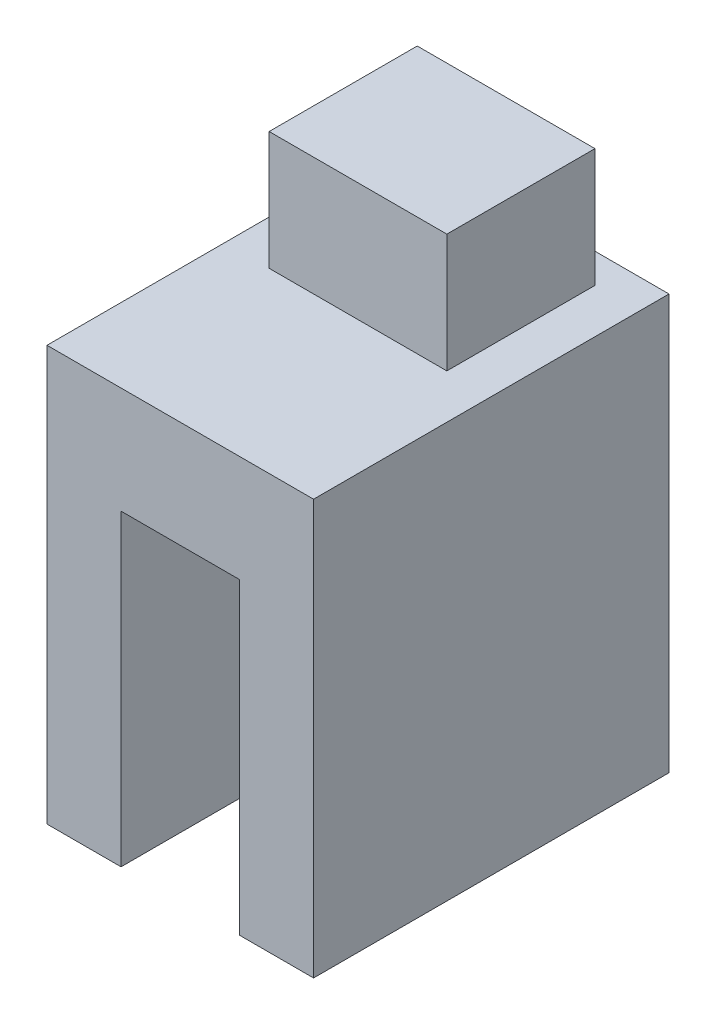
ISO-10303-21;
HEADER;
FILE_DESCRIPTION(('STEP AP214'),'2;1');
FILE_NAME('part.step','',(''),(''),'','','');
FILE_SCHEMA(('AUTOMOTIVE_DESIGN { 1 0 10303 214 1 1 1 1 }'));
ENDSEC;
DATA;
#1=APPLICATION_CONTEXT('core data for automotive mechanical design processes');
#2=APPLICATION_PROTOCOL_DEFINITION('international standard','automotive_design',2000,#1);
#3=PRODUCT_CONTEXT('',#1,'mechanical');
#4=PRODUCT('Part','Part','',(#3));
#5=PRODUCT_RELATED_PRODUCT_CATEGORY('part','',(#4));
#6=PRODUCT_DEFINITION_FORMATION('','',#4);
#7=PRODUCT_DEFINITION_CONTEXT('part definition',#1,'design');
#8=PRODUCT_DEFINITION('design','',#6,#7);
#9=PRODUCT_DEFINITION_SHAPE('','',#8);
#10=(LENGTH_UNIT() NAMED_UNIT(*) SI_UNIT(.MILLI.,.METRE.));
#11=(NAMED_UNIT(*) PLANE_ANGLE_UNIT() SI_UNIT($,.RADIAN.));
#12=(NAMED_UNIT(*) SI_UNIT($,.STERADIAN.) SOLID_ANGLE_UNIT());
#13=UNCERTAINTY_MEASURE_WITH_UNIT(LENGTH_MEASURE(1.E-05),#10,'distance_accuracy_value','');
#14=(GEOMETRIC_REPRESENTATION_CONTEXT(3) GLOBAL_UNCERTAINTY_ASSIGNED_CONTEXT((#13)) GLOBAL_UNIT_ASSIGNED_CONTEXT((#10,
#11,#12)) REPRESENTATION_CONTEXT('',''));
#15=CARTESIAN_POINT('',(0.,0.,0.));
#16=DIRECTION('',(0.,0.,1.));
#17=DIRECTION('',(1.,0.,0.));
#18=AXIS2_PLACEMENT_3D('',#15,#16,#17);
#19=CARTESIAN_POINT('',(0.,0.,0.));
#20=DIRECTION('',(0.,-1.,0.));
#21=DIRECTION('',(0.,0.,-1.));
#22=AXIS2_PLACEMENT_3D('',#19,#20,#21);
#23=PLANE('',#22);
#24=DIRECTION('',(0.,0.,-1.));
#25=VECTOR('',#24,1.);
#26=CARTESIAN_POINT('',(-3.175,0.,-9.525));
#27=LINE('',#26,#25);
#28=CARTESIAN_POINT('',(-3.175,0.,9.525));
#29=VERTEX_POINT('',#28);
#30=CARTESIAN_POINT('',(-3.175,0.,-9.525));
#31=VERTEX_POINT('',#30);
#32=EDGE_CURVE('E134',#29,#31,#27,.T.);
#33=ORIENTED_EDGE('',*,*,#32,.F.);
#34=DIRECTION('',(1.,0.,0.));
#35=VECTOR('',#34,1.);
#36=CARTESIAN_POINT('',(-7.14375,0.,9.525));
#37=LINE('',#36,#35);
#38=CARTESIAN_POINT('',(-7.14375,0.,9.525));
#39=VERTEX_POINT('',#38);
#40=EDGE_CURVE('E222',#39,#29,#37,.T.);
#41=ORIENTED_EDGE('',*,*,#40,.F.);
#42=DIRECTION('',(0.,0.,1.));
#43=VECTOR('',#42,1.);
#44=CARTESIAN_POINT('',(-7.14375,0.,9.525));
#45=LINE('',#44,#43);
#46=CARTESIAN_POINT('',(-7.14375,0.,-9.525));
#47=VERTEX_POINT('',#46);
#48=EDGE_CURVE('E239',#47,#39,#45,.T.);
#49=ORIENTED_EDGE('',*,*,#48,.F.);
#50=DIRECTION('',(-1.,0.,0.));
#51=VECTOR('',#50,1.);
#52=CARTESIAN_POINT('',(-7.14375,0.,-9.525));
#53=LINE('',#52,#51);
#54=EDGE_CURVE('E235',#31,#47,#53,.T.);
#55=ORIENTED_EDGE('',*,*,#54,.F.);
#56=EDGE_LOOP('',(#33,#41,#49,#55));
#57=FACE_BOUND('',#56,.T.);
#58=ADVANCED_FACE('F39',(#57),#23,.T.);
#59=CARTESIAN_POINT('',(0.,22.225,0.));
#60=DIRECTION('',(0.,-1.,0.));
#61=DIRECTION('',(0.,0.,-1.));
#62=AXIS2_PLACEMENT_3D('',#59,#60,#61);
#63=PLANE('',#62);
#64=DIRECTION('',(0.,0.,-1.));
#65=VECTOR('',#64,1.);
#66=CARTESIAN_POINT('',(7.14375,22.225,9.525));
#67=LINE('',#66,#65);
#68=CARTESIAN_POINT('',(7.14375,22.225,9.525));
#69=VERTEX_POINT('',#68);
#70=CARTESIAN_POINT('',(7.14375,22.225,-9.525));
#71=VERTEX_POINT('',#70);
#72=EDGE_CURVE('E217',#69,#71,#67,.T.);
#73=ORIENTED_EDGE('',*,*,#72,.T.);
#74=DIRECTION('',(-1.,0.,0.));
#75=VECTOR('',#74,1.);
#76=CARTESIAN_POINT('',(-7.14375,22.225,-9.525));
#77=LINE('',#76,#75);
#78=CARTESIAN_POINT('',(-7.14375,22.225,-9.525));
#79=VERTEX_POINT('',#78);
#80=EDGE_CURVE('E221',#71,#79,#77,.T.);
#81=ORIENTED_EDGE('',*,*,#80,.T.);
#82=DIRECTION('',(0.,0.,1.));
#83=VECTOR('',#82,1.);
#84=CARTESIAN_POINT('',(-7.14375,22.225,9.525));
#85=LINE('',#84,#83);
#86=CARTESIAN_POINT('',(-7.14375,22.225,9.525));
#87=VERTEX_POINT('',#86);
#88=EDGE_CURVE('E225',#79,#87,#85,.T.);
#89=ORIENTED_EDGE('',*,*,#88,.T.);
#90=DIRECTION('',(1.,0.,0.));
#91=VECTOR('',#90,1.);
#92=CARTESIAN_POINT('',(-7.14375,22.225,9.525));
#93=LINE('',#92,#91);
#94=EDGE_CURVE('E228',#87,#69,#93,.T.);
#95=ORIENTED_EDGE('',*,*,#94,.T.);
#96=EDGE_LOOP('',(#73,#81,#89,#95));
#97=FACE_BOUND('',#96,.T.);
#98=DIRECTION('',(0.,0.,1.));
#99=VECTOR('',#98,1.);
#100=CARTESIAN_POINT('',(-4.7625,22.225,-7.9375));
#101=LINE('',#100,#99);
#102=CARTESIAN_POINT('',(-4.7625,22.225,-7.9375));
#103=VERTEX_POINT('',#102);
#104=CARTESIAN_POINT('',(-4.7625,22.225,0.));
#105=VERTEX_POINT('',#104);
#106=EDGE_CURVE('E63',#103,#105,#101,.T.);
#107=ORIENTED_EDGE('',*,*,#106,.F.);
#108=DIRECTION('',(1.,0.,0.));
#109=VECTOR('',#108,1.);
#110=CARTESIAN_POINT('',(-4.7625,22.225,-7.9375));
#111=LINE('',#110,#109);
#112=CARTESIAN_POINT('',(4.7625,22.225,-7.9375));
#113=VERTEX_POINT('',#112);
#114=EDGE_CURVE('E179',#103,#113,#111,.T.);
#115=ORIENTED_EDGE('',*,*,#114,.T.);
#116=DIRECTION('',(0.,0.,1.));
#117=VECTOR('',#116,1.);
#118=CARTESIAN_POINT('',(4.7625,22.225,-7.9375));
#119=LINE('',#118,#117);
#120=CARTESIAN_POINT('',(4.7625,22.225,0.));
#121=VERTEX_POINT('',#120);
#122=EDGE_CURVE('E197',#113,#121,#119,.T.);
#123=ORIENTED_EDGE('',*,*,#122,.T.);
#124=DIRECTION('',(1.,0.,0.));
#125=VECTOR('',#124,1.);
#126=CARTESIAN_POINT('',(-4.7625,22.225,0.));
#127=LINE('',#126,#125);
#128=EDGE_CURVE('E193',#105,#121,#127,.T.);
#129=ORIENTED_EDGE('',*,*,#128,.F.);
#130=EDGE_LOOP('',(#107,#115,#123,#129));
#131=FACE_BOUND('',#130,.T.);
#132=ADVANCED_FACE('F268',(#97,#131),#63,.F.);
#133=CARTESIAN_POINT('',(7.14375,22.225,9.525));
#134=DIRECTION('',(-1.,0.,0.));
#135=DIRECTION('',(0.,0.,1.));
#136=AXIS2_PLACEMENT_3D('',#133,#134,#135);
#137=PLANE('',#136);
#138=DIRECTION('',(0.,0.,-1.));
#139=VECTOR('',#138,1.);
#140=CARTESIAN_POINT('',(7.14375,0.,9.525));
#141=LINE('',#140,#139);
#142=CARTESIAN_POINT('',(7.14375,0.,9.525));
#143=VERTEX_POINT('',#142);
#144=CARTESIAN_POINT('',(7.14375,0.,-9.525));
#145=VERTEX_POINT('',#144);
#146=EDGE_CURVE('E216',#143,#145,#141,.T.);
#147=ORIENTED_EDGE('',*,*,#146,.T.);
#148=DIRECTION('',(0.,-1.,0.));
#149=VECTOR('',#148,1.);
#150=CARTESIAN_POINT('',(7.14375,22.225,-9.525));
#151=LINE('',#150,#149);
#152=EDGE_CURVE('E11',#71,#145,#151,.T.);
#153=ORIENTED_EDGE('',*,*,#152,.F.);
#154=ORIENTED_EDGE('',*,*,#72,.F.);
#155=DIRECTION('',(0.,-1.,0.));
#156=VECTOR('',#155,1.);
#157=CARTESIAN_POINT('',(7.14375,22.225,9.525));
#158=LINE('',#157,#156);
#159=EDGE_CURVE('E231',#69,#143,#158,.T.);
#160=ORIENTED_EDGE('',*,*,#159,.T.);
#161=EDGE_LOOP('',(#147,#153,#154,#160));
#162=FACE_BOUND('',#161,.T.);
#163=ADVANCED_FACE('F41',(#162),#137,.F.);
#164=CARTESIAN_POINT('',(-7.14375,22.225,-9.525));
#165=DIRECTION('',(0.,0.,1.));
#166=DIRECTION('',(1.,0.,0.));
#167=AXIS2_PLACEMENT_3D('',#164,#165,#166);
#168=PLANE('',#167);
#169=DIRECTION('',(1.,0.,0.));
#170=VECTOR('',#169,1.);
#171=CARTESIAN_POINT('',(3.175,16.51,-9.525));
#172=LINE('',#171,#170);
#173=CARTESIAN_POINT('',(-3.175,16.51,-9.525));
#174=VERTEX_POINT('',#173);
#175=CARTESIAN_POINT('',(3.175,16.51,-9.525));
#176=VERTEX_POINT('',#175);
#177=EDGE_CURVE('E145',#174,#176,#172,.T.);
#178=ORIENTED_EDGE('',*,*,#177,.F.);
#179=DIRECTION('',(0.,-1.,0.));
#180=VECTOR('',#179,1.);
#181=CARTESIAN_POINT('',(-3.175,16.51,-9.525));
#182=LINE('',#181,#180);
#183=EDGE_CURVE('E128',#174,#31,#182,.T.);
#184=ORIENTED_EDGE('',*,*,#183,.T.);
#185=ORIENTED_EDGE('',*,*,#54,.T.);
#186=DIRECTION('',(0.,-1.,0.));
#187=VECTOR('',#186,1.);
#188=CARTESIAN_POINT('',(-7.14375,22.225,-9.525));
#189=LINE('',#188,#187);
#190=EDGE_CURVE('E48',#79,#47,#189,.T.);
#191=ORIENTED_EDGE('',*,*,#190,.F.);
#192=ORIENTED_EDGE('',*,*,#80,.F.);
#193=ORIENTED_EDGE('',*,*,#152,.T.);
#194=CARTESIAN_POINT('',(3.175,0.,-9.525));
#195=VERTEX_POINT('',#194);
#196=EDGE_CURVE('E236',#145,#195,#53,.T.);
#197=ORIENTED_EDGE('',*,*,#196,.T.);
#198=DIRECTION('',(0.,-1.,0.));
#199=VECTOR('',#198,1.);
#200=CARTESIAN_POINT('',(3.175,16.51,-9.525));
#201=LINE('',#200,#199);
#202=EDGE_CURVE('E55',#176,#195,#201,.T.);
#203=ORIENTED_EDGE('',*,*,#202,.F.);
#204=EDGE_LOOP('',(#178,#184,#185,#191,#192,#193,#197,#203));
#205=FACE_BOUND('',#204,.T.);
#206=ADVANCED_FACE('F151',(#205),#168,.F.);
#207=CARTESIAN_POINT('',(-7.14375,22.225,9.525));
#208=DIRECTION('',(1.,0.,0.));
#209=DIRECTION('',(0.,0.,-1.));
#210=AXIS2_PLACEMENT_3D('',#207,#208,#209);
#211=PLANE('',#210);
#212=ORIENTED_EDGE('',*,*,#48,.T.);
#213=DIRECTION('',(0.,-1.,0.));
#214=VECTOR('',#213,1.);
#215=CARTESIAN_POINT('',(-7.14375,22.225,9.525));
#216=LINE('',#215,#214);
#217=EDGE_CURVE('E249',#87,#39,#216,.T.);
#218=ORIENTED_EDGE('',*,*,#217,.F.);
#219=ORIENTED_EDGE('',*,*,#88,.F.);
#220=ORIENTED_EDGE('',*,*,#190,.T.);
#221=EDGE_LOOP('',(#212,#218,#219,#220));
#222=FACE_BOUND('',#221,.T.);
#223=ADVANCED_FACE('F258',(#222),#211,.F.);
#224=CARTESIAN_POINT('',(-7.14375,22.225,9.525));
#225=DIRECTION('',(0.,0.,-1.));
#226=DIRECTION('',(-1.,0.,0.));
#227=AXIS2_PLACEMENT_3D('',#224,#225,#226);
#228=PLANE('',#227);
#229=ORIENTED_EDGE('',*,*,#40,.T.);
#230=DIRECTION('',(0.,-1.,0.));
#231=VECTOR('',#230,1.);
#232=CARTESIAN_POINT('',(-3.175,16.51,9.525));
#233=LINE('',#232,#231);
#234=CARTESIAN_POINT('',(-3.175,16.51,9.525));
#235=VERTEX_POINT('',#234);
#236=EDGE_CURVE('E165',#235,#29,#233,.T.);
#237=ORIENTED_EDGE('',*,*,#236,.F.);
#238=DIRECTION('',(-1.,0.,0.));
#239=VECTOR('',#238,1.);
#240=CARTESIAN_POINT('',(3.175,16.51,9.525));
#241=LINE('',#240,#239);
#242=CARTESIAN_POINT('',(3.175,16.51,9.525));
#243=VERTEX_POINT('',#242);
#244=EDGE_CURVE('E139',#243,#235,#241,.T.);
#245=ORIENTED_EDGE('',*,*,#244,.F.);
#246=DIRECTION('',(0.,-1.,0.));
#247=VECTOR('',#246,1.);
#248=CARTESIAN_POINT('',(3.175,16.51,9.525));
#249=LINE('',#248,#247);
#250=CARTESIAN_POINT('',(3.175,0.,9.525));
#251=VERTEX_POINT('',#250);
#252=EDGE_CURVE('E168',#243,#251,#249,.T.);
#253=ORIENTED_EDGE('',*,*,#252,.T.);
#254=EDGE_CURVE('E242',#251,#143,#37,.T.);
#255=ORIENTED_EDGE('',*,*,#254,.T.);
#256=ORIENTED_EDGE('',*,*,#159,.F.);
#257=ORIENTED_EDGE('',*,*,#94,.F.);
#258=ORIENTED_EDGE('',*,*,#217,.T.);
#259=EDGE_LOOP('',(#229,#237,#245,#253,#255,#256,#257,#258));
#260=FACE_BOUND('',#259,.T.);
#261=ADVANCED_FACE('F263',(#260),#228,.F.);
#262=DIRECTION('',(0.,0.,1.));
#263=VECTOR('',#262,1.);
#264=CARTESIAN_POINT('',(3.175,0.,-9.525));
#265=LINE('',#264,#263);
#266=EDGE_CURVE('E149',#195,#251,#265,.T.);
#267=ORIENTED_EDGE('',*,*,#266,.F.);
#268=ORIENTED_EDGE('',*,*,#196,.F.);
#269=ORIENTED_EDGE('',*,*,#146,.F.);
#270=ORIENTED_EDGE('',*,*,#254,.F.);
#271=EDGE_LOOP('',(#267,#268,#269,#270));
#272=FACE_BOUND('',#271,.T.);
#273=ADVANCED_FACE('F274',(#272),#23,.T.);
#274=CARTESIAN_POINT('',(-4.7625,28.575,-7.9375));
#275=DIRECTION('',(1.,0.,0.));
#276=DIRECTION('',(0.,0.,-1.));
#277=AXIS2_PLACEMENT_3D('',#274,#275,#276);
#278=PLANE('',#277);
#279=ORIENTED_EDGE('',*,*,#106,.T.);
#280=DIRECTION('',(0.,-1.,0.));
#281=VECTOR('',#280,1.);
#282=CARTESIAN_POINT('',(-4.7625,28.575,0.));
#283=LINE('',#282,#281);
#284=CARTESIAN_POINT('',(-4.7625,28.575,0.));
#285=VERTEX_POINT('',#284);
#286=EDGE_CURVE('E212',#285,#105,#283,.T.);
#287=ORIENTED_EDGE('',*,*,#286,.F.);
#288=DIRECTION('',(0.,0.,1.));
#289=VECTOR('',#288,1.);
#290=CARTESIAN_POINT('',(-4.7625,28.575,-7.9375));
#291=LINE('',#290,#289);
#292=CARTESIAN_POINT('',(-4.7625,28.575,-7.9375));
#293=VERTEX_POINT('',#292);
#294=EDGE_CURVE('E174',#293,#285,#291,.T.);
#295=ORIENTED_EDGE('',*,*,#294,.F.);
#296=DIRECTION('',(0.,-1.,0.));
#297=VECTOR('',#296,1.);
#298=CARTESIAN_POINT('',(-4.7625,28.575,-7.9375));
#299=LINE('',#298,#297);
#300=EDGE_CURVE('E190',#293,#103,#299,.T.);
#301=ORIENTED_EDGE('',*,*,#300,.T.);
#302=EDGE_LOOP('',(#279,#287,#295,#301));
#303=FACE_BOUND('',#302,.T.);
#304=ADVANCED_FACE('F295',(#303),#278,.F.);
#305=CARTESIAN_POINT('',(-4.7625,28.575,0.));
#306=DIRECTION('',(0.,0.,-1.));
#307=DIRECTION('',(-1.,0.,0.));
#308=AXIS2_PLACEMENT_3D('',#305,#306,#307);
#309=PLANE('',#308);
#310=ORIENTED_EDGE('',*,*,#128,.T.);
#311=DIRECTION('',(0.,-1.,0.));
#312=VECTOR('',#311,1.);
#313=CARTESIAN_POINT('',(4.7625,28.575,0.));
#314=LINE('',#313,#312);
#315=CARTESIAN_POINT('',(4.7625,28.575,0.));
#316=VERTEX_POINT('',#315);
#317=EDGE_CURVE('E208',#316,#121,#314,.T.);
#318=ORIENTED_EDGE('',*,*,#317,.F.);
#319=DIRECTION('',(1.,0.,0.));
#320=VECTOR('',#319,1.);
#321=CARTESIAN_POINT('',(-4.7625,28.575,0.));
#322=LINE('',#321,#320);
#323=EDGE_CURVE('E178',#285,#316,#322,.T.);
#324=ORIENTED_EDGE('',*,*,#323,.F.);
#325=ORIENTED_EDGE('',*,*,#286,.T.);
#326=EDGE_LOOP('',(#310,#318,#324,#325));
#327=FACE_BOUND('',#326,.T.);
#328=ADVANCED_FACE('F300',(#327),#309,.F.);
#329=CARTESIAN_POINT('',(4.7625,28.575,-7.9375));
#330=DIRECTION('',(1.,0.,0.));
#331=DIRECTION('',(0.,0.,-1.));
#332=AXIS2_PLACEMENT_3D('',#329,#330,#331);
#333=PLANE('',#332);
#334=ORIENTED_EDGE('',*,*,#122,.F.);
#335=DIRECTION('',(0.,-1.,0.));
#336=VECTOR('',#335,1.);
#337=CARTESIAN_POINT('',(4.7625,28.575,-7.9375));
#338=LINE('',#337,#336);
#339=CARTESIAN_POINT('',(4.7625,28.575,-7.9375));
#340=VERTEX_POINT('',#339);
#341=EDGE_CURVE('E204',#340,#113,#338,.T.);
#342=ORIENTED_EDGE('',*,*,#341,.F.);
#343=DIRECTION('',(0.,0.,1.));
#344=VECTOR('',#343,1.);
#345=CARTESIAN_POINT('',(4.7625,28.575,-7.9375));
#346=LINE('',#345,#344);
#347=EDGE_CURVE('E182',#340,#316,#346,.T.);
#348=ORIENTED_EDGE('',*,*,#347,.T.);
#349=ORIENTED_EDGE('',*,*,#317,.T.);
#350=EDGE_LOOP('',(#334,#342,#348,#349));
#351=FACE_BOUND('',#350,.T.);
#352=ADVANCED_FACE('F336',(#351),#333,.T.);
#353=CARTESIAN_POINT('',(-4.7625,28.575,-7.9375));
#354=DIRECTION('',(0.,0.,-1.));
#355=DIRECTION('',(-1.,0.,0.));
#356=AXIS2_PLACEMENT_3D('',#353,#354,#355);
#357=PLANE('',#356);
#358=ORIENTED_EDGE('',*,*,#114,.F.);
#359=ORIENTED_EDGE('',*,*,#300,.F.);
#360=DIRECTION('',(1.,0.,0.));
#361=VECTOR('',#360,1.);
#362=CARTESIAN_POINT('',(-4.7625,28.575,-7.9375));
#363=LINE('',#362,#361);
#364=EDGE_CURVE('E186',#293,#340,#363,.T.);
#365=ORIENTED_EDGE('',*,*,#364,.T.);
#366=ORIENTED_EDGE('',*,*,#341,.T.);
#367=EDGE_LOOP('',(#358,#359,#365,#366));
#368=FACE_BOUND('',#367,.T.);
#369=ADVANCED_FACE('F346',(#368),#357,.T.);
#370=CARTESIAN_POINT('',(0.,28.575,0.));
#371=DIRECTION('',(0.,1.,0.));
#372=DIRECTION('',(0.,0.,1.));
#373=AXIS2_PLACEMENT_3D('',#370,#371,#372);
#374=PLANE('',#373);
#375=ORIENTED_EDGE('',*,*,#294,.T.);
#376=ORIENTED_EDGE('',*,*,#323,.T.);
#377=ORIENTED_EDGE('',*,*,#347,.F.);
#378=ORIENTED_EDGE('',*,*,#364,.F.);
#379=EDGE_LOOP('',(#375,#376,#377,#378));
#380=FACE_BOUND('',#379,.T.);
#381=ADVANCED_FACE('F285',(#380),#374,.T.);
#382=CARTESIAN_POINT('',(-3.175,16.51,-9.525));
#383=DIRECTION('',(-1.,0.,0.));
#384=DIRECTION('',(0.,0.,1.));
#385=AXIS2_PLACEMENT_3D('',#382,#383,#384);
#386=PLANE('',#385);
#387=ORIENTED_EDGE('',*,*,#32,.T.);
#388=ORIENTED_EDGE('',*,*,#183,.F.);
#389=DIRECTION('',(0.,0.,-1.));
#390=VECTOR('',#389,1.);
#391=CARTESIAN_POINT('',(-3.175,16.51,-9.525));
#392=LINE('',#391,#390);
#393=EDGE_CURVE('E131',#235,#174,#392,.T.);
#394=ORIENTED_EDGE('',*,*,#393,.F.);
#395=ORIENTED_EDGE('',*,*,#236,.T.);
#396=EDGE_LOOP('',(#387,#388,#394,#395));
#397=FACE_BOUND('',#396,.T.);
#398=ADVANCED_FACE('F130',(#397),#386,.F.);
#399=CARTESIAN_POINT('',(3.175,16.51,-9.525));
#400=DIRECTION('',(1.,0.,0.));
#401=DIRECTION('',(0.,0.,-1.));
#402=AXIS2_PLACEMENT_3D('',#399,#400,#401);
#403=PLANE('',#402);
#404=ORIENTED_EDGE('',*,*,#266,.T.);
#405=ORIENTED_EDGE('',*,*,#252,.F.);
#406=DIRECTION('',(0.,0.,1.));
#407=VECTOR('',#406,1.);
#408=CARTESIAN_POINT('',(3.175,16.51,-9.525));
#409=LINE('',#408,#407);
#410=EDGE_CURVE('E154',#176,#243,#409,.T.);
#411=ORIENTED_EDGE('',*,*,#410,.F.);
#412=ORIENTED_EDGE('',*,*,#202,.T.);
#413=EDGE_LOOP('',(#404,#405,#411,#412));
#414=FACE_BOUND('',#413,.T.);
#415=ADVANCED_FACE('F275',(#414),#403,.F.);
#416=CARTESIAN_POINT('',(0.,16.51,0.));
#417=DIRECTION('',(0.,-1.,0.));
#418=DIRECTION('',(0.,0.,-1.));
#419=AXIS2_PLACEMENT_3D('',#416,#417,#418);
#420=PLANE('',#419);
#421=ORIENTED_EDGE('',*,*,#393,.T.);
#422=ORIENTED_EDGE('',*,*,#177,.T.);
#423=ORIENTED_EDGE('',*,*,#410,.T.);
#424=ORIENTED_EDGE('',*,*,#244,.T.);
#425=EDGE_LOOP('',(#421,#422,#423,#424));
#426=FACE_BOUND('',#425,.T.);
#427=ADVANCED_FACE('F143',(#426),#420,.T.);
#428=CLOSED_SHELL('',(#58,#132,#163,#206,#223,#261,#273,#304,#328,#352,#369,#381,#398,#415,#427));
#429=MANIFOLD_SOLID_BREP('B2',#428);
#430=ADVANCED_BREP_SHAPE_REPRESENTATION('',(#18,#429),#14);
#431=SHAPE_DEFINITION_REPRESENTATION(#9,#430);
ENDSEC;
END-ISO-10303-21;
